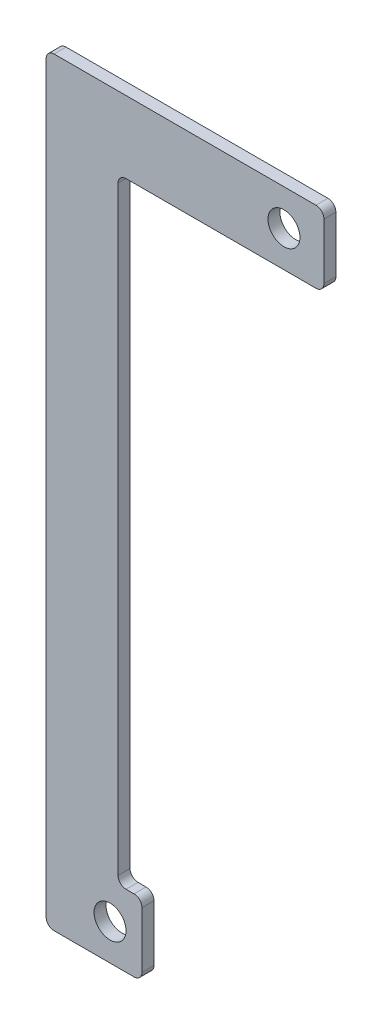
ISO-10303-21;
HEADER;
FILE_DESCRIPTION(('STEP AP214'),'2;1');
FILE_NAME('part.step','',(''),(''),'','','');
FILE_SCHEMA(('AUTOMOTIVE_DESIGN { 1 0 10303 214 1 1 1 1 }'));
ENDSEC;
DATA;
#1=APPLICATION_CONTEXT('core data for automotive mechanical design processes');
#2=APPLICATION_PROTOCOL_DEFINITION('international standard','automotive_design',2000,#1);
#3=PRODUCT_CONTEXT('',#1,'mechanical');
#4=PRODUCT('Part','Part','',(#3));
#5=PRODUCT_RELATED_PRODUCT_CATEGORY('part','',(#4));
#6=PRODUCT_DEFINITION_FORMATION('','',#4);
#7=PRODUCT_DEFINITION_CONTEXT('part definition',#1,'design');
#8=PRODUCT_DEFINITION('design','',#6,#7);
#9=PRODUCT_DEFINITION_SHAPE('','',#8);
#10=(LENGTH_UNIT() NAMED_UNIT(*) SI_UNIT(.MILLI.,.METRE.));
#11=(NAMED_UNIT(*) PLANE_ANGLE_UNIT() SI_UNIT($,.RADIAN.));
#12=(NAMED_UNIT(*) SI_UNIT($,.STERADIAN.) SOLID_ANGLE_UNIT());
#13=UNCERTAINTY_MEASURE_WITH_UNIT(LENGTH_MEASURE(1.E-05),#10,'distance_accuracy_value','');
#14=(GEOMETRIC_REPRESENTATION_CONTEXT(3) GLOBAL_UNCERTAINTY_ASSIGNED_CONTEXT((#13)) GLOBAL_UNIT_ASSIGNED_CONTEXT((#10,
#11,#12)) REPRESENTATION_CONTEXT('',''));
#15=CARTESIAN_POINT('',(0.,0.,0.));
#16=DIRECTION('',(0.,0.,1.));
#17=DIRECTION('',(1.,0.,0.));
#18=AXIS2_PLACEMENT_3D('',#15,#16,#17);
#19=CARTESIAN_POINT('',(1.,94.0000056728726,1.5));
#20=DIRECTION('',(0.,0.,-1.));
#21=DIRECTION('',(-1.,0.,0.));
#22=AXIS2_PLACEMENT_3D('',#19,#20,#21);
#23=PLANE('',#22);
#24=CARTESIAN_POINT('',(1.,94.0000056728726,1.5));
#25=DIRECTION('',(0.,0.,1.));
#26=DIRECTION('',(-1.,0.,0.));
#27=AXIS2_PLACEMENT_3D('',#24,#25,#26);
#28=CIRCLE('',#27,1.);
#29=CARTESIAN_POINT('',(1.,95.0000056728726,1.5));
#30=VERTEX_POINT('',#29);
#31=CARTESIAN_POINT('',(0.,94.0000056728726,1.5));
#32=VERTEX_POINT('',#31);
#33=EDGE_CURVE('E209',#30,#32,#28,.T.);
#34=ORIENTED_EDGE('',*,*,#33,.T.);
#35=DIRECTION('',(0.,-1.,0.));
#36=VECTOR('',#35,1.);
#37=CARTESIAN_POINT('',(0.,1.,1.5));
#38=LINE('',#37,#36);
#39=CARTESIAN_POINT('',(0.,1.,1.5));
#40=VERTEX_POINT('',#39);
#41=EDGE_CURVE('E117',#32,#40,#38,.T.);
#42=ORIENTED_EDGE('',*,*,#41,.T.);
#43=CARTESIAN_POINT('',(1.,1.,1.5));
#44=DIRECTION('',(0.,0.,1.));
#45=DIRECTION('',(-1.,0.,0.));
#46=AXIS2_PLACEMENT_3D('',#43,#44,#45);
#47=CIRCLE('',#46,1.);
#48=CARTESIAN_POINT('',(1.,0.,1.5));
#49=VERTEX_POINT('',#48);
#50=EDGE_CURVE('E248',#40,#49,#47,.T.);
#51=ORIENTED_EDGE('',*,*,#50,.T.);
#52=DIRECTION('',(1.,0.,0.));
#53=VECTOR('',#52,1.);
#54=CARTESIAN_POINT('',(11.,0.,1.5));
#55=LINE('',#54,#53);
#56=CARTESIAN_POINT('',(11.,0.,1.5));
#57=VERTEX_POINT('',#56);
#58=EDGE_CURVE('E267',#49,#57,#55,.T.);
#59=ORIENTED_EDGE('',*,*,#58,.T.);
#60=CARTESIAN_POINT('',(11.,1.,1.5));
#61=DIRECTION('',(0.,0.,1.));
#62=DIRECTION('',(-1.,0.,0.));
#63=AXIS2_PLACEMENT_3D('',#60,#61,#62);
#64=CIRCLE('',#63,1.);
#65=CARTESIAN_POINT('',(12.,1.,1.5));
#66=VERTEX_POINT('',#65);
#67=EDGE_CURVE('E264',#57,#66,#64,.T.);
#68=ORIENTED_EDGE('',*,*,#67,.T.);
#69=DIRECTION('',(0.,1.,0.));
#70=VECTOR('',#69,1.);
#71=CARTESIAN_POINT('',(12.,8.00000000000002,1.5));
#72=LINE('',#71,#70);
#73=CARTESIAN_POINT('',(12.,8.00000000000002,1.5));
#74=VERTEX_POINT('',#73);
#75=EDGE_CURVE('E266',#66,#74,#72,.T.);
#76=ORIENTED_EDGE('',*,*,#75,.T.);
#77=CARTESIAN_POINT('',(11.,8.00000000000002,1.5));
#78=DIRECTION('',(0.,0.,1.));
#79=DIRECTION('',(1.,0.,0.));
#80=AXIS2_PLACEMENT_3D('',#77,#78,#79);
#81=CIRCLE('',#80,1.);
#82=CARTESIAN_POINT('',(11.,9.00000000000002,1.5));
#83=VERTEX_POINT('',#82);
#84=EDGE_CURVE('E269',#74,#83,#81,.T.);
#85=ORIENTED_EDGE('',*,*,#84,.T.);
#86=DIRECTION('',(-1.,0.,0.));
#87=VECTOR('',#86,1.);
#88=CARTESIAN_POINT('',(10.,9.00000000000002,1.5));
#89=LINE('',#88,#87);
#90=CARTESIAN_POINT('',(10.,9.00000000000002,1.5));
#91=VERTEX_POINT('',#90);
#92=EDGE_CURVE('E275',#83,#91,#89,.T.);
#93=ORIENTED_EDGE('',*,*,#92,.T.);
#94=CARTESIAN_POINT('',(10.,10.,1.5));
#95=DIRECTION('',(0.,0.,-1.));
#96=DIRECTION('',(1.,0.,0.));
#97=AXIS2_PLACEMENT_3D('',#94,#95,#96);
#98=CIRCLE('',#97,1.);
#99=CARTESIAN_POINT('',(9.00000000000001,10.,1.5));
#100=VERTEX_POINT('',#99);
#101=EDGE_CURVE('E277',#91,#100,#98,.T.);
#102=ORIENTED_EDGE('',*,*,#101,.T.);
#103=DIRECTION('',(0.,1.,0.));
#104=VECTOR('',#103,1.);
#105=CARTESIAN_POINT('',(9.,85.0000056728725,1.5));
#106=LINE('',#105,#104);
#107=CARTESIAN_POINT('',(9.,85.0000056728725,1.5));
#108=VERTEX_POINT('',#107);
#109=EDGE_CURVE('E279',#100,#108,#106,.T.);
#110=ORIENTED_EDGE('',*,*,#109,.T.);
#111=CARTESIAN_POINT('',(10.,85.0000056728725,1.5));
#112=DIRECTION('',(0.,0.,-1.));
#113=DIRECTION('',(1.,0.,0.));
#114=AXIS2_PLACEMENT_3D('',#111,#112,#113);
#115=CIRCLE('',#114,1.00000000000001);
#116=CARTESIAN_POINT('',(10.,86.0000056728725,1.5));
#117=VERTEX_POINT('',#116);
#118=EDGE_CURVE('E281',#108,#117,#115,.T.);
#119=ORIENTED_EDGE('',*,*,#118,.T.);
#120=DIRECTION('',(1.,0.,0.));
#121=VECTOR('',#120,1.);
#122=CARTESIAN_POINT('',(33.7600083679962,86.0000056728725,1.5));
#123=LINE('',#122,#121);
#124=CARTESIAN_POINT('',(33.7600083679962,86.0000056728725,1.5));
#125=VERTEX_POINT('',#124);
#126=EDGE_CURVE('E283',#117,#125,#123,.T.);
#127=ORIENTED_EDGE('',*,*,#126,.T.);
#128=CARTESIAN_POINT('',(33.7600083679962,87.0000056728725,1.5));
#129=DIRECTION('',(0.,0.,1.));
#130=DIRECTION('',(-1.,0.,0.));
#131=AXIS2_PLACEMENT_3D('',#128,#129,#130);
#132=CIRCLE('',#131,1.);
#133=CARTESIAN_POINT('',(34.7600083679962,87.0000056728725,1.5));
#134=VERTEX_POINT('',#133);
#135=EDGE_CURVE('E160',#125,#134,#132,.T.);
#136=ORIENTED_EDGE('',*,*,#135,.T.);
#137=DIRECTION('',(0.,1.,0.));
#138=VECTOR('',#137,1.);
#139=CARTESIAN_POINT('',(34.7600083679962,94.0000056728726,1.5));
#140=LINE('',#139,#138);
#141=CARTESIAN_POINT('',(34.7600083679962,94.0000056728726,1.5));
#142=VERTEX_POINT('',#141);
#143=EDGE_CURVE('E154',#134,#142,#140,.T.);
#144=ORIENTED_EDGE('',*,*,#143,.T.);
#145=CARTESIAN_POINT('',(33.7600083679962,94.0000056728726,1.5));
#146=DIRECTION('',(0.,0.,1.));
#147=DIRECTION('',(-1.,0.,0.));
#148=AXIS2_PLACEMENT_3D('',#145,#146,#147);
#149=CIRCLE('',#148,1.);
#150=CARTESIAN_POINT('',(33.7600083679962,95.0000056728726,1.5));
#151=VERTEX_POINT('',#150);
#152=EDGE_CURVE('E158',#142,#151,#149,.T.);
#153=ORIENTED_EDGE('',*,*,#152,.T.);
#154=DIRECTION('',(-1.,0.,0.));
#155=VECTOR('',#154,1.);
#156=CARTESIAN_POINT('',(1.,95.0000056728726,1.5));
#157=LINE('',#156,#155);
#158=EDGE_CURVE('E50',#151,#30,#157,.T.);
#159=ORIENTED_EDGE('',*,*,#158,.T.);
#160=EDGE_LOOP('',(#34,#42,#51,#59,#68,#76,#85,#93,#102,#110,#119,#127,#136,#144,#153,#159));
#161=FACE_BOUND('',#160,.T.);
#162=CARTESIAN_POINT('',(8.,4.50000000000001,1.5));
#163=DIRECTION('',(0.,0.,1.));
#164=DIRECTION('',(1.,0.,0.));
#165=AXIS2_PLACEMENT_3D('',#162,#163,#164);
#166=CIRCLE('',#165,2.);
#167=CARTESIAN_POINT('',(10.,4.50000000000001,1.5));
#168=VERTEX_POINT('',#167);
#169=EDGE_CURVE('E182',#168,#168,#166,.T.);
#170=ORIENTED_EDGE('',*,*,#169,.F.);
#171=EDGE_LOOP('',(#170));
#172=FACE_BOUND('',#171,.T.);
#173=CARTESIAN_POINT('',(29.7600083679962,90.5000056728726,1.5));
#174=DIRECTION('',(0.,0.,1.));
#175=DIRECTION('',(1.,0.,0.));
#176=AXIS2_PLACEMENT_3D('',#173,#174,#175);
#177=CIRCLE('',#176,2.00000000000001);
#178=CARTESIAN_POINT('',(31.7600083679962,90.5000056728726,1.5));
#179=VERTEX_POINT('',#178);
#180=EDGE_CURVE('E324',#179,#179,#177,.T.);
#181=ORIENTED_EDGE('',*,*,#180,.F.);
#182=EDGE_LOOP('',(#181));
#183=FACE_BOUND('',#182,.T.);
#184=ADVANCED_FACE('F33',(#161,#172,#183),#23,.F.);
#185=CARTESIAN_POINT('',(1.,94.0000056728726,0.));
#186=DIRECTION('',(0.,0.,-1.));
#187=DIRECTION('',(-1.,0.,0.));
#188=AXIS2_PLACEMENT_3D('',#185,#186,#187);
#189=PLANE('',#188);
#190=CARTESIAN_POINT('',(8.,4.50000000000001,0.));
#191=DIRECTION('',(0.,0.,1.));
#192=DIRECTION('',(1.,0.,0.));
#193=AXIS2_PLACEMENT_3D('',#190,#191,#192);
#194=CIRCLE('',#193,2.);
#195=CARTESIAN_POINT('',(10.,4.50000000000001,0.));
#196=VERTEX_POINT('',#195);
#197=EDGE_CURVE('E329',#196,#196,#194,.T.);
#198=ORIENTED_EDGE('',*,*,#197,.T.);
#199=EDGE_LOOP('',(#198));
#200=FACE_BOUND('',#199,.T.);
#201=CARTESIAN_POINT('',(1.,94.0000056728726,0.));
#202=DIRECTION('',(0.,0.,1.));
#203=DIRECTION('',(-1.,0.,0.));
#204=AXIS2_PLACEMENT_3D('',#201,#202,#203);
#205=CIRCLE('',#204,1.);
#206=CARTESIAN_POINT('',(1.,95.0000056728726,0.));
#207=VERTEX_POINT('',#206);
#208=CARTESIAN_POINT('',(0.,94.0000056728726,0.));
#209=VERTEX_POINT('',#208);
#210=EDGE_CURVE('E178',#207,#209,#205,.T.);
#211=ORIENTED_EDGE('',*,*,#210,.F.);
#212=DIRECTION('',(-1.,0.,0.));
#213=VECTOR('',#212,1.);
#214=CARTESIAN_POINT('',(1.,95.0000056728726,0.));
#215=LINE('',#214,#213);
#216=CARTESIAN_POINT('',(33.7600083679962,95.0000056728726,0.));
#217=VERTEX_POINT('',#216);
#218=EDGE_CURVE('E109',#217,#207,#215,.T.);
#219=ORIENTED_EDGE('',*,*,#218,.F.);
#220=CARTESIAN_POINT('',(33.7600083679962,94.0000056728726,0.));
#221=DIRECTION('',(0.,0.,1.));
#222=DIRECTION('',(-1.,0.,0.));
#223=AXIS2_PLACEMENT_3D('',#220,#221,#222);
#224=CIRCLE('',#223,1.);
#225=CARTESIAN_POINT('',(34.7600083679962,94.0000056728726,0.));
#226=VERTEX_POINT('',#225);
#227=EDGE_CURVE('E103',#226,#217,#224,.T.);
#228=ORIENTED_EDGE('',*,*,#227,.F.);
#229=DIRECTION('',(0.,1.,0.));
#230=VECTOR('',#229,1.);
#231=CARTESIAN_POINT('',(34.7600083679962,94.0000056728726,0.));
#232=LINE('',#231,#230);
#233=CARTESIAN_POINT('',(34.7600083679962,87.0000056728725,0.));
#234=VERTEX_POINT('',#233);
#235=EDGE_CURVE('E168',#234,#226,#232,.T.);
#236=ORIENTED_EDGE('',*,*,#235,.F.);
#237=CARTESIAN_POINT('',(33.7600083679962,87.0000056728725,0.));
#238=DIRECTION('',(0.,0.,1.));
#239=DIRECTION('',(-1.,0.,0.));
#240=AXIS2_PLACEMENT_3D('',#237,#238,#239);
#241=CIRCLE('',#240,1.);
#242=CARTESIAN_POINT('',(33.7600083679962,86.0000056728725,0.));
#243=VERTEX_POINT('',#242);
#244=EDGE_CURVE('E204',#243,#234,#241,.T.);
#245=ORIENTED_EDGE('',*,*,#244,.F.);
#246=DIRECTION('',(1.,0.,0.));
#247=VECTOR('',#246,1.);
#248=CARTESIAN_POINT('',(33.7600083679962,86.0000056728725,0.));
#249=LINE('',#248,#247);
#250=CARTESIAN_POINT('',(10.,86.0000056728725,0.));
#251=VERTEX_POINT('',#250);
#252=EDGE_CURVE('E202',#251,#243,#249,.T.);
#253=ORIENTED_EDGE('',*,*,#252,.F.);
#254=CARTESIAN_POINT('',(10.,85.0000056728725,0.));
#255=DIRECTION('',(0.,0.,-1.));
#256=DIRECTION('',(1.,0.,0.));
#257=AXIS2_PLACEMENT_3D('',#254,#255,#256);
#258=CIRCLE('',#257,1.00000000000001);
#259=CARTESIAN_POINT('',(9.,85.0000056728725,0.));
#260=VERTEX_POINT('',#259);
#261=EDGE_CURVE('E200',#260,#251,#258,.T.);
#262=ORIENTED_EDGE('',*,*,#261,.F.);
#263=DIRECTION('',(0.,1.,0.));
#264=VECTOR('',#263,1.);
#265=CARTESIAN_POINT('',(9.,85.0000056728725,0.));
#266=LINE('',#265,#264);
#267=CARTESIAN_POINT('',(9.00000000000001,10.,0.));
#268=VERTEX_POINT('',#267);
#269=EDGE_CURVE('E198',#268,#260,#266,.T.);
#270=ORIENTED_EDGE('',*,*,#269,.F.);
#271=CARTESIAN_POINT('',(10.,10.,0.));
#272=DIRECTION('',(0.,0.,-1.));
#273=DIRECTION('',(1.,0.,0.));
#274=AXIS2_PLACEMENT_3D('',#271,#272,#273);
#275=CIRCLE('',#274,1.);
#276=CARTESIAN_POINT('',(10.,9.00000000000002,0.));
#277=VERTEX_POINT('',#276);
#278=EDGE_CURVE('E196',#277,#268,#275,.T.);
#279=ORIENTED_EDGE('',*,*,#278,.F.);
#280=DIRECTION('',(-1.,0.,0.));
#281=VECTOR('',#280,1.);
#282=CARTESIAN_POINT('',(10.,9.00000000000002,0.));
#283=LINE('',#282,#281);
#284=CARTESIAN_POINT('',(11.,9.00000000000002,0.));
#285=VERTEX_POINT('',#284);
#286=EDGE_CURVE('E194',#285,#277,#283,.T.);
#287=ORIENTED_EDGE('',*,*,#286,.F.);
#288=CARTESIAN_POINT('',(11.,8.00000000000002,0.));
#289=DIRECTION('',(0.,0.,1.));
#290=DIRECTION('',(1.,0.,0.));
#291=AXIS2_PLACEMENT_3D('',#288,#289,#290);
#292=CIRCLE('',#291,1.);
#293=CARTESIAN_POINT('',(12.,8.00000000000002,0.));
#294=VERTEX_POINT('',#293);
#295=EDGE_CURVE('E192',#294,#285,#292,.T.);
#296=ORIENTED_EDGE('',*,*,#295,.F.);
#297=DIRECTION('',(0.,1.,0.));
#298=VECTOR('',#297,1.);
#299=CARTESIAN_POINT('',(12.,8.00000000000002,0.));
#300=LINE('',#299,#298);
#301=CARTESIAN_POINT('',(12.,1.,0.));
#302=VERTEX_POINT('',#301);
#303=EDGE_CURVE('E190',#302,#294,#300,.T.);
#304=ORIENTED_EDGE('',*,*,#303,.F.);
#305=CARTESIAN_POINT('',(11.,1.,0.));
#306=DIRECTION('',(0.,0.,1.));
#307=DIRECTION('',(-1.,0.,0.));
#308=AXIS2_PLACEMENT_3D('',#305,#306,#307);
#309=CIRCLE('',#308,1.);
#310=CARTESIAN_POINT('',(11.,0.,0.));
#311=VERTEX_POINT('',#310);
#312=EDGE_CURVE('E188',#311,#302,#309,.T.);
#313=ORIENTED_EDGE('',*,*,#312,.F.);
#314=DIRECTION('',(1.,0.,0.));
#315=VECTOR('',#314,1.);
#316=CARTESIAN_POINT('',(11.,0.,0.));
#317=LINE('',#316,#315);
#318=CARTESIAN_POINT('',(1.,0.,0.));
#319=VERTEX_POINT('',#318);
#320=EDGE_CURVE('E186',#319,#311,#317,.T.);
#321=ORIENTED_EDGE('',*,*,#320,.F.);
#322=CARTESIAN_POINT('',(1.,1.,0.));
#323=DIRECTION('',(0.,0.,1.));
#324=DIRECTION('',(-1.,0.,0.));
#325=AXIS2_PLACEMENT_3D('',#322,#323,#324);
#326=CIRCLE('',#325,1.);
#327=CARTESIAN_POINT('',(0.,1.,0.));
#328=VERTEX_POINT('',#327);
#329=EDGE_CURVE('E184',#328,#319,#326,.T.);
#330=ORIENTED_EDGE('',*,*,#329,.F.);
#331=DIRECTION('',(0.,-1.,0.));
#332=VECTOR('',#331,1.);
#333=CARTESIAN_POINT('',(0.,1.,0.));
#334=LINE('',#333,#332);
#335=EDGE_CURVE('E181',#209,#328,#334,.T.);
#336=ORIENTED_EDGE('',*,*,#335,.F.);
#337=EDGE_LOOP('',(#211,#219,#228,#236,#245,#253,#262,#270,#279,#287,#296,#304,#313,#321,#330,#336));
#338=FACE_BOUND('',#337,.T.);
#339=CARTESIAN_POINT('',(29.7600083679962,90.5000056728726,0.));
#340=DIRECTION('',(0.,0.,1.));
#341=DIRECTION('',(1.,0.,0.));
#342=AXIS2_PLACEMENT_3D('',#339,#340,#341);
#343=CIRCLE('',#342,2.00000000000001);
#344=CARTESIAN_POINT('',(31.7600083679962,90.5000056728726,0.));
#345=VERTEX_POINT('',#344);
#346=EDGE_CURVE('E327',#345,#345,#343,.T.);
#347=ORIENTED_EDGE('',*,*,#346,.T.);
#348=EDGE_LOOP('',(#347));
#349=FACE_BOUND('',#348,.T.);
#350=ADVANCED_FACE('F252',(#200,#338,#349),#189,.T.);
#351=CARTESIAN_POINT('',(1.,94.0000056728726,1.5));
#352=DIRECTION('',(0.,0.,-1.));
#353=DIRECTION('',(-1.,0.,0.));
#354=AXIS2_PLACEMENT_3D('',#351,#352,#353);
#355=CYLINDRICAL_SURFACE('',#354,1.);
#356=ORIENTED_EDGE('',*,*,#210,.T.);
#357=DIRECTION('',(0.,0.,-1.));
#358=VECTOR('',#357,1.);
#359=CARTESIAN_POINT('',(0.,94.0000056728726,1.5));
#360=LINE('',#359,#358);
#361=EDGE_CURVE('E11',#32,#209,#360,.T.);
#362=ORIENTED_EDGE('',*,*,#361,.F.);
#363=ORIENTED_EDGE('',*,*,#33,.F.);
#364=DIRECTION('',(0.,0.,-1.));
#365=VECTOR('',#364,1.);
#366=CARTESIAN_POINT('',(1.,95.0000056728726,1.5));
#367=LINE('',#366,#365);
#368=EDGE_CURVE('E174',#30,#207,#367,.T.);
#369=ORIENTED_EDGE('',*,*,#368,.T.);
#370=EDGE_LOOP('',(#356,#362,#363,#369));
#371=FACE_BOUND('',#370,.T.);
#372=ADVANCED_FACE('F35',(#371),#355,.T.);
#373=CARTESIAN_POINT('',(0.,1.,1.5));
#374=DIRECTION('',(1.,0.,0.));
#375=DIRECTION('',(0.,0.,-1.));
#376=AXIS2_PLACEMENT_3D('',#373,#374,#375);
#377=PLANE('',#376);
#378=ORIENTED_EDGE('',*,*,#335,.T.);
#379=DIRECTION('',(0.,0.,-1.));
#380=VECTOR('',#379,1.);
#381=CARTESIAN_POINT('',(0.,1.,1.5));
#382=LINE('',#381,#380);
#383=EDGE_CURVE('E42',#40,#328,#382,.T.);
#384=ORIENTED_EDGE('',*,*,#383,.F.);
#385=ORIENTED_EDGE('',*,*,#41,.F.);
#386=ORIENTED_EDGE('',*,*,#361,.T.);
#387=EDGE_LOOP('',(#378,#384,#385,#386));
#388=FACE_BOUND('',#387,.T.);
#389=ADVANCED_FACE('F464',(#388),#377,.F.);
#390=CARTESIAN_POINT('',(1.,1.,1.5));
#391=DIRECTION('',(0.,0.,-1.));
#392=DIRECTION('',(-1.,0.,0.));
#393=AXIS2_PLACEMENT_3D('',#390,#391,#392);
#394=CYLINDRICAL_SURFACE('',#393,1.);
#395=ORIENTED_EDGE('',*,*,#329,.T.);
#396=DIRECTION('',(0.,0.,-1.));
#397=VECTOR('',#396,1.);
#398=CARTESIAN_POINT('',(1.,0.,1.5));
#399=LINE('',#398,#397);
#400=EDGE_CURVE('E240',#49,#319,#399,.T.);
#401=ORIENTED_EDGE('',*,*,#400,.F.);
#402=ORIENTED_EDGE('',*,*,#50,.F.);
#403=ORIENTED_EDGE('',*,*,#383,.T.);
#404=EDGE_LOOP('',(#395,#401,#402,#403));
#405=FACE_BOUND('',#404,.T.);
#406=ADVANCED_FACE('F246',(#405),#394,.T.);
#407=CARTESIAN_POINT('',(11.,0.,1.5));
#408=DIRECTION('',(0.,1.,0.));
#409=DIRECTION('',(0.,0.,1.));
#410=AXIS2_PLACEMENT_3D('',#407,#408,#409);
#411=PLANE('',#410);
#412=ORIENTED_EDGE('',*,*,#320,.T.);
#413=DIRECTION('',(0.,0.,-1.));
#414=VECTOR('',#413,1.);
#415=CARTESIAN_POINT('',(11.,0.,1.5));
#416=LINE('',#415,#414);
#417=EDGE_CURVE('E237',#57,#311,#416,.T.);
#418=ORIENTED_EDGE('',*,*,#417,.F.);
#419=ORIENTED_EDGE('',*,*,#58,.F.);
#420=ORIENTED_EDGE('',*,*,#400,.T.);
#421=EDGE_LOOP('',(#412,#418,#419,#420));
#422=FACE_BOUND('',#421,.T.);
#423=ADVANCED_FACE('F258',(#422),#411,.F.);
#424=CARTESIAN_POINT('',(11.,1.,1.5));
#425=DIRECTION('',(0.,0.,-1.));
#426=DIRECTION('',(-1.,0.,0.));
#427=AXIS2_PLACEMENT_3D('',#424,#425,#426);
#428=CYLINDRICAL_SURFACE('',#427,1.);
#429=ORIENTED_EDGE('',*,*,#312,.T.);
#430=DIRECTION('',(0.,0.,-1.));
#431=VECTOR('',#430,1.);
#432=CARTESIAN_POINT('',(12.,1.,1.5));
#433=LINE('',#432,#431);
#434=EDGE_CURVE('E234',#66,#302,#433,.T.);
#435=ORIENTED_EDGE('',*,*,#434,.F.);
#436=ORIENTED_EDGE('',*,*,#67,.F.);
#437=ORIENTED_EDGE('',*,*,#417,.T.);
#438=EDGE_LOOP('',(#429,#435,#436,#437));
#439=FACE_BOUND('',#438,.T.);
#440=ADVANCED_FACE('F262',(#439),#428,.T.);
#441=CARTESIAN_POINT('',(12.,8.00000000000002,1.5));
#442=DIRECTION('',(-1.,0.,0.));
#443=DIRECTION('',(0.,0.,1.));
#444=AXIS2_PLACEMENT_3D('',#441,#442,#443);
#445=PLANE('',#444);
#446=ORIENTED_EDGE('',*,*,#303,.T.);
#447=DIRECTION('',(0.,0.,-1.));
#448=VECTOR('',#447,1.);
#449=CARTESIAN_POINT('',(12.,8.00000000000002,1.5));
#450=LINE('',#449,#448);
#451=EDGE_CURVE('E231',#74,#294,#450,.T.);
#452=ORIENTED_EDGE('',*,*,#451,.F.);
#453=ORIENTED_EDGE('',*,*,#75,.F.);
#454=ORIENTED_EDGE('',*,*,#434,.T.);
#455=EDGE_LOOP('',(#446,#452,#453,#454));
#456=FACE_BOUND('',#455,.T.);
#457=ADVANCED_FACE('F429',(#456),#445,.F.);
#458=CARTESIAN_POINT('',(11.,8.00000000000002,1.5));
#459=DIRECTION('',(0.,0.,-1.));
#460=DIRECTION('',(-1.,0.,0.));
#461=AXIS2_PLACEMENT_3D('',#458,#459,#460);
#462=CYLINDRICAL_SURFACE('',#461,1.);
#463=ORIENTED_EDGE('',*,*,#295,.T.);
#464=DIRECTION('',(0.,0.,-1.));
#465=VECTOR('',#464,1.);
#466=CARTESIAN_POINT('',(11.,9.00000000000002,1.5));
#467=LINE('',#466,#465);
#468=EDGE_CURVE('E228',#83,#285,#467,.T.);
#469=ORIENTED_EDGE('',*,*,#468,.F.);
#470=ORIENTED_EDGE('',*,*,#84,.F.);
#471=ORIENTED_EDGE('',*,*,#451,.T.);
#472=EDGE_LOOP('',(#463,#469,#470,#471));
#473=FACE_BOUND('',#472,.T.);
#474=ADVANCED_FACE('F419',(#473),#462,.T.);
#475=CARTESIAN_POINT('',(10.,9.00000000000002,1.5));
#476=DIRECTION('',(0.,-1.,0.));
#477=DIRECTION('',(1.,0.,0.));
#478=AXIS2_PLACEMENT_3D('',#475,#476,#477);
#479=PLANE('',#478);
#480=ORIENTED_EDGE('',*,*,#286,.T.);
#481=DIRECTION('',(0.,0.,-1.));
#482=VECTOR('',#481,1.);
#483=CARTESIAN_POINT('',(10.,9.00000000000002,1.5));
#484=LINE('',#483,#482);
#485=EDGE_CURVE('E225',#91,#277,#484,.T.);
#486=ORIENTED_EDGE('',*,*,#485,.F.);
#487=ORIENTED_EDGE('',*,*,#92,.F.);
#488=ORIENTED_EDGE('',*,*,#468,.T.);
#489=EDGE_LOOP('',(#480,#486,#487,#488));
#490=FACE_BOUND('',#489,.T.);
#491=ADVANCED_FACE('F409',(#490),#479,.F.);
#492=CARTESIAN_POINT('',(10.,10.,1.5));
#493=DIRECTION('',(0.,0.,-1.));
#494=DIRECTION('',(-1.,0.,0.));
#495=AXIS2_PLACEMENT_3D('',#492,#493,#494);
#496=CYLINDRICAL_SURFACE('',#495,1.);
#497=ORIENTED_EDGE('',*,*,#278,.T.);
#498=DIRECTION('',(0.,0.,-1.));
#499=VECTOR('',#498,1.);
#500=CARTESIAN_POINT('',(9.00000000000001,10.,1.5));
#501=LINE('',#500,#499);
#502=EDGE_CURVE('E222',#100,#268,#501,.T.);
#503=ORIENTED_EDGE('',*,*,#502,.F.);
#504=ORIENTED_EDGE('',*,*,#101,.F.);
#505=ORIENTED_EDGE('',*,*,#485,.T.);
#506=EDGE_LOOP('',(#497,#503,#504,#505));
#507=FACE_BOUND('',#506,.T.);
#508=ADVANCED_FACE('F399',(#507),#496,.F.);
#509=CARTESIAN_POINT('',(9.,85.0000056728725,1.5));
#510=DIRECTION('',(-1.,0.,0.));
#511=DIRECTION('',(0.,-1.,0.));
#512=AXIS2_PLACEMENT_3D('',#509,#510,#511);
#513=PLANE('',#512);
#514=ORIENTED_EDGE('',*,*,#269,.T.);
#515=DIRECTION('',(0.,0.,-1.));
#516=VECTOR('',#515,1.);
#517=CARTESIAN_POINT('',(9.,85.0000056728725,1.5));
#518=LINE('',#517,#516);
#519=EDGE_CURVE('E219',#108,#260,#518,.T.);
#520=ORIENTED_EDGE('',*,*,#519,.F.);
#521=ORIENTED_EDGE('',*,*,#109,.F.);
#522=ORIENTED_EDGE('',*,*,#502,.T.);
#523=EDGE_LOOP('',(#514,#520,#521,#522));
#524=FACE_BOUND('',#523,.T.);
#525=ADVANCED_FACE('F389',(#524),#513,.F.);
#526=CARTESIAN_POINT('',(10.,85.0000056728725,1.5));
#527=DIRECTION('',(0.,0.,-1.));
#528=DIRECTION('',(-1.,0.,0.));
#529=AXIS2_PLACEMENT_3D('',#526,#527,#528);
#530=CYLINDRICAL_SURFACE('',#529,1.00000000000001);
#531=ORIENTED_EDGE('',*,*,#261,.T.);
#532=DIRECTION('',(0.,0.,-1.));
#533=VECTOR('',#532,1.);
#534=CARTESIAN_POINT('',(10.,86.0000056728725,1.5));
#535=LINE('',#534,#533);
#536=EDGE_CURVE('E216',#117,#251,#535,.T.);
#537=ORIENTED_EDGE('',*,*,#536,.F.);
#538=ORIENTED_EDGE('',*,*,#118,.F.);
#539=ORIENTED_EDGE('',*,*,#519,.T.);
#540=EDGE_LOOP('',(#531,#537,#538,#539));
#541=FACE_BOUND('',#540,.T.);
#542=ADVANCED_FACE('F380',(#541),#530,.F.);
#543=CARTESIAN_POINT('',(33.7600083679962,86.0000056728725,1.5));
#544=DIRECTION('',(0.,1.,0.));
#545=DIRECTION('',(-1.,0.,0.));
#546=AXIS2_PLACEMENT_3D('',#543,#544,#545);
#547=PLANE('',#546);
#548=ORIENTED_EDGE('',*,*,#252,.T.);
#549=DIRECTION('',(0.,0.,-1.));
#550=VECTOR('',#549,1.);
#551=CARTESIAN_POINT('',(33.7600083679962,86.0000056728725,1.5));
#552=LINE('',#551,#550);
#553=EDGE_CURVE('E213',#125,#243,#552,.T.);
#554=ORIENTED_EDGE('',*,*,#553,.F.);
#555=ORIENTED_EDGE('',*,*,#126,.F.);
#556=ORIENTED_EDGE('',*,*,#536,.T.);
#557=EDGE_LOOP('',(#548,#554,#555,#556));
#558=FACE_BOUND('',#557,.T.);
#559=ADVANCED_FACE('F289',(#558),#547,.F.);
#560=CARTESIAN_POINT('',(33.7600083679962,87.0000056728725,1.5));
#561=DIRECTION('',(0.,0.,-1.));
#562=DIRECTION('',(-1.,0.,0.));
#563=AXIS2_PLACEMENT_3D('',#560,#561,#562);
#564=CYLINDRICAL_SURFACE('',#563,1.);
#565=ORIENTED_EDGE('',*,*,#244,.T.);
#566=DIRECTION('',(0.,0.,-1.));
#567=VECTOR('',#566,1.);
#568=CARTESIAN_POINT('',(34.7600083679962,87.0000056728725,1.5));
#569=LINE('',#568,#567);
#570=EDGE_CURVE('E169',#134,#234,#569,.T.);
#571=ORIENTED_EDGE('',*,*,#570,.F.);
#572=ORIENTED_EDGE('',*,*,#135,.F.);
#573=ORIENTED_EDGE('',*,*,#553,.T.);
#574=EDGE_LOOP('',(#565,#571,#572,#573));
#575=FACE_BOUND('',#574,.T.);
#576=ADVANCED_FACE('F293',(#575),#564,.T.);
#577=CARTESIAN_POINT('',(34.7600083679962,94.0000056728726,1.5));
#578=DIRECTION('',(-1.,0.,0.));
#579=DIRECTION('',(0.,0.,1.));
#580=AXIS2_PLACEMENT_3D('',#577,#578,#579);
#581=PLANE('',#580);
#582=ORIENTED_EDGE('',*,*,#235,.T.);
#583=DIRECTION('',(0.,0.,-1.));
#584=VECTOR('',#583,1.);
#585=CARTESIAN_POINT('',(34.7600083679962,94.0000056728726,1.5));
#586=LINE('',#585,#584);
#587=EDGE_CURVE('E165',#142,#226,#586,.T.);
#588=ORIENTED_EDGE('',*,*,#587,.F.);
#589=ORIENTED_EDGE('',*,*,#143,.F.);
#590=ORIENTED_EDGE('',*,*,#570,.T.);
#591=EDGE_LOOP('',(#582,#588,#589,#590));
#592=FACE_BOUND('',#591,.T.);
#593=ADVANCED_FACE('F166',(#592),#581,.F.);
#594=CARTESIAN_POINT('',(33.7600083679962,94.0000056728726,1.5));
#595=DIRECTION('',(0.,0.,-1.));
#596=DIRECTION('',(-1.,0.,0.));
#597=AXIS2_PLACEMENT_3D('',#594,#595,#596);
#598=CYLINDRICAL_SURFACE('',#597,1.);
#599=ORIENTED_EDGE('',*,*,#227,.T.);
#600=DIRECTION('',(0.,0.,-1.));
#601=VECTOR('',#600,1.);
#602=CARTESIAN_POINT('',(33.7600083679962,95.0000056728726,1.5));
#603=LINE('',#602,#601);
#604=EDGE_CURVE('E170',#151,#217,#603,.T.);
#605=ORIENTED_EDGE('',*,*,#604,.F.);
#606=ORIENTED_EDGE('',*,*,#152,.F.);
#607=ORIENTED_EDGE('',*,*,#587,.T.);
#608=EDGE_LOOP('',(#599,#605,#606,#607));
#609=FACE_BOUND('',#608,.T.);
#610=ADVANCED_FACE('F172',(#609),#598,.T.);
#611=CARTESIAN_POINT('',(1.,95.0000056728726,1.5));
#612=DIRECTION('',(0.,-1.,0.));
#613=DIRECTION('',(0.,0.,-1.));
#614=AXIS2_PLACEMENT_3D('',#611,#612,#613);
#615=PLANE('',#614);
#616=ORIENTED_EDGE('',*,*,#218,.T.);
#617=ORIENTED_EDGE('',*,*,#368,.F.);
#618=ORIENTED_EDGE('',*,*,#158,.F.);
#619=ORIENTED_EDGE('',*,*,#604,.T.);
#620=EDGE_LOOP('',(#616,#617,#618,#619));
#621=FACE_BOUND('',#620,.T.);
#622=ADVANCED_FACE('F297',(#621),#615,.F.);
#623=CARTESIAN_POINT('',(8.,4.50000000000001,1.5));
#624=DIRECTION('',(0.,0.,-1.));
#625=DIRECTION('',(-1.,0.,0.));
#626=AXIS2_PLACEMENT_3D('',#623,#624,#625);
#627=CYLINDRICAL_SURFACE('',#626,2.);
#628=ORIENTED_EDGE('',*,*,#169,.T.);
#629=EDGE_LOOP('',(#628));
#630=FACE_BOUND('',#629,.T.);
#631=ORIENTED_EDGE('',*,*,#197,.F.);
#632=EDGE_LOOP('',(#631));
#633=FACE_BOUND('',#632,.T.);
#634=ADVANCED_FACE('F299',(#630,#633),#627,.F.);
#635=CARTESIAN_POINT('',(29.7600083679962,90.5000056728726,1.5));
#636=DIRECTION('',(0.,0.,-1.));
#637=DIRECTION('',(-1.,0.,0.));
#638=AXIS2_PLACEMENT_3D('',#635,#636,#637);
#639=CYLINDRICAL_SURFACE('',#638,2.00000000000001);
#640=ORIENTED_EDGE('',*,*,#180,.T.);
#641=EDGE_LOOP('',(#640));
#642=FACE_BOUND('',#641,.T.);
#643=ORIENTED_EDGE('',*,*,#346,.F.);
#644=EDGE_LOOP('',(#643));
#645=FACE_BOUND('',#644,.T.);
#646=ADVANCED_FACE('F305',(#642,#645),#639,.F.);
#647=CLOSED_SHELL('',(#184,#350,#372,#389,#406,#423,#440,#457,#474,#491,#508,#525,#542,#559,
#576,#593,#610,#622,#634,#646));
#648=MANIFOLD_SOLID_BREP('B2',#647);
#649=ADVANCED_BREP_SHAPE_REPRESENTATION('',(#18,#648),#14);
#650=SHAPE_DEFINITION_REPRESENTATION(#9,#649);
ENDSEC;
END-ISO-10303-21;
